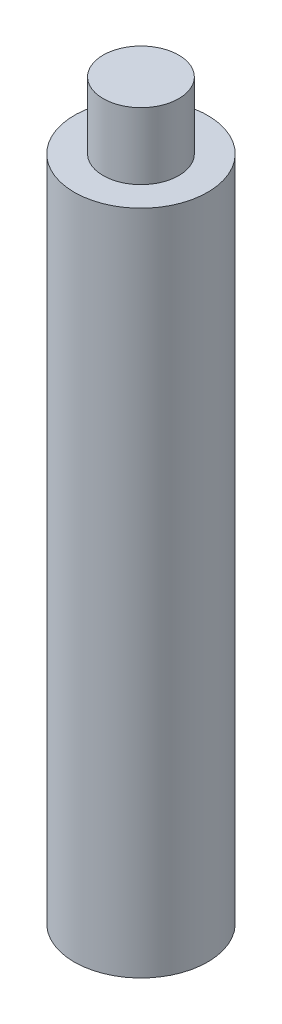
ISO-10303-21;
HEADER;
FILE_DESCRIPTION(('STEP AP214'),'2;1');
FILE_NAME('part.step','',(''),(''),'','','');
FILE_SCHEMA(('AUTOMOTIVE_DESIGN { 1 0 10303 214 1 1 1 1 }'));
ENDSEC;
DATA;
#1=APPLICATION_CONTEXT('core data for automotive mechanical design processes');
#2=APPLICATION_PROTOCOL_DEFINITION('international standard','automotive_design',2000,#1);
#3=PRODUCT_CONTEXT('',#1,'mechanical');
#4=PRODUCT('Part','Part','',(#3));
#5=PRODUCT_RELATED_PRODUCT_CATEGORY('part','',(#4));
#6=PRODUCT_DEFINITION_FORMATION('','',#4);
#7=PRODUCT_DEFINITION_CONTEXT('part definition',#1,'design');
#8=PRODUCT_DEFINITION('design','',#6,#7);
#9=PRODUCT_DEFINITION_SHAPE('','',#8);
#10=(LENGTH_UNIT() NAMED_UNIT(*) SI_UNIT(.MILLI.,.METRE.));
#11=(NAMED_UNIT(*) PLANE_ANGLE_UNIT() SI_UNIT($,.RADIAN.));
#12=(NAMED_UNIT(*) SI_UNIT($,.STERADIAN.) SOLID_ANGLE_UNIT());
#13=UNCERTAINTY_MEASURE_WITH_UNIT(LENGTH_MEASURE(1.E-05),#10,'distance_accuracy_value','');
#14=(GEOMETRIC_REPRESENTATION_CONTEXT(3) GLOBAL_UNCERTAINTY_ASSIGNED_CONTEXT((#13)) GLOBAL_UNIT_ASSIGNED_CONTEXT((#10,
#11,#12)) REPRESENTATION_CONTEXT('',''));
#15=CARTESIAN_POINT('',(0.,0.,0.));
#16=DIRECTION('',(0.,0.,1.));
#17=DIRECTION('',(1.,0.,0.));
#18=AXIS2_PLACEMENT_3D('',#15,#16,#17);
#19=CARTESIAN_POINT('',(-54.3568054312168,-67.0985978800645,-8.65683378398795));
#20=DIRECTION('',(0.,-1.,0.));
#21=DIRECTION('',(0.,0.,-1.));
#22=AXIS2_PLACEMENT_3D('',#19,#20,#21);
#23=CYLINDRICAL_SURFACE('',#22,1.7);
#24=CARTESIAN_POINT('',(-54.3568054312168,-67.0985978800645,-8.65683378398795));
#25=DIRECTION('',(0.,1.,0.));
#26=DIRECTION('',(0.,0.,1.));
#27=AXIS2_PLACEMENT_3D('',#24,#25,#26);
#28=CIRCLE('',#27,1.7);
#29=CARTESIAN_POINT('',(-54.3568054312168,-67.0985978800645,-6.95683378398795));
#30=VERTEX_POINT('',#29);
#31=EDGE_CURVE('E11',#30,#30,#28,.T.);
#32=ORIENTED_EDGE('',*,*,#31,.F.);
#33=EDGE_LOOP('',(#32));
#34=FACE_BOUND('',#33,.T.);
#35=CARTESIAN_POINT('',(-54.3568054312168,-70.0985978800645,-8.65683378398795));
#36=DIRECTION('',(0.,1.,0.));
#37=DIRECTION('',(0.,0.,1.));
#38=AXIS2_PLACEMENT_3D('',#35,#36,#37);
#39=CIRCLE('',#38,1.7);
#40=CARTESIAN_POINT('',(-54.3568054312168,-70.0985978800645,-6.95683378398795));
#41=VERTEX_POINT('',#40);
#42=EDGE_CURVE('E48',#41,#41,#39,.T.);
#43=ORIENTED_EDGE('',*,*,#42,.T.);
#44=EDGE_LOOP('',(#43));
#45=FACE_BOUND('',#44,.T.);
#46=ADVANCED_FACE('F44',(#34,#45),#23,.T.);
#47=CARTESIAN_POINT('',(-54.3568054312168,-67.0985978800645,-8.65683378398795));
#48=DIRECTION('',(0.,1.,0.));
#49=DIRECTION('',(0.,0.,1.));
#50=AXIS2_PLACEMENT_3D('',#47,#48,#49);
#51=PLANE('',#50);
#52=ORIENTED_EDGE('',*,*,#31,.T.);
#53=EDGE_LOOP('',(#52));
#54=FACE_BOUND('',#53,.T.);
#55=ADVANCED_FACE('F58',(#54),#51,.T.);
#56=CARTESIAN_POINT('',(-54.3568054312168,-70.0985978800645,-8.65683378398795));
#57=DIRECTION('',(0.,1.,0.));
#58=DIRECTION('',(0.,0.,1.));
#59=AXIS2_PLACEMENT_3D('',#56,#57,#58);
#60=PLANE('',#59);
#61=ORIENTED_EDGE('',*,*,#42,.F.);
#62=EDGE_LOOP('',(#61));
#63=FACE_BOUND('',#62,.T.);
#64=ADVANCED_FACE('F59',(#63),#60,.F.);
#65=CLOSED_SHELL('',(#46,#55,#64));
#66=MANIFOLD_SOLID_BREP('B2',#65);
#67=CARTESIAN_POINT('',(-54.3568054312168,-70.0985978800645,-8.65683378398795));
#68=DIRECTION('',(0.,1.,0.));
#69=DIRECTION('',(0.,0.,1.));
#70=AXIS2_PLACEMENT_3D('',#67,#68,#69);
#71=PLANE('',#70);
#72=CARTESIAN_POINT('',(-54.3568054312168,-70.0985978800645,-8.65683378398795));
#73=DIRECTION('',(0.,1.,0.));
#74=DIRECTION('',(0.,0.,1.));
#75=AXIS2_PLACEMENT_3D('',#72,#73,#74);
#76=CIRCLE('',#75,3.);
#77=CARTESIAN_POINT('',(-54.3568054312168,-70.0985978800645,-5.65683378398795));
#78=VERTEX_POINT('',#77);
#79=EDGE_CURVE('E42',#78,#78,#76,.T.);
#80=ORIENTED_EDGE('',*,*,#79,.T.);
#81=EDGE_LOOP('',(#80));
#82=FACE_BOUND('',#81,.T.);
#83=CARTESIAN_POINT('',(-54.3568054312168,-70.0985978800645,-8.65683378398795));
#84=DIRECTION('',(0.,1.,0.));
#85=DIRECTION('',(0.,0.,1.));
#86=AXIS2_PLACEMENT_3D('',#83,#84,#85);
#87=CIRCLE('',#86,1.7);
#88=CARTESIAN_POINT('',(-54.3568054312168,-70.0985978800645,-6.95683378398795));
#89=VERTEX_POINT('',#88);
#90=EDGE_CURVE('E100',#89,#89,#87,.T.);
#91=ORIENTED_EDGE('',*,*,#90,.F.);
#92=EDGE_LOOP('',(#91));
#93=FACE_BOUND('',#92,.T.);
#94=ADVANCED_FACE('F88',(#82,#93),#71,.T.);
#95=CARTESIAN_POINT('',(-54.3568054312168,-100.098597880065,-8.65683378398795));
#96=DIRECTION('',(0.,1.,0.));
#97=DIRECTION('',(0.,0.,1.));
#98=AXIS2_PLACEMENT_3D('',#95,#96,#97);
#99=PLANE('',#98);
#100=CARTESIAN_POINT('',(-54.3568054312168,-100.098597880065,-8.65683378398795));
#101=DIRECTION('',(0.,1.,0.));
#102=DIRECTION('',(0.,0.,1.));
#103=AXIS2_PLACEMENT_3D('',#100,#101,#102);
#104=CIRCLE('',#103,3.);
#105=CARTESIAN_POINT('',(-54.3568054312168,-100.098597880065,-5.65683378398795));
#106=VERTEX_POINT('',#105);
#107=EDGE_CURVE('E89',#106,#106,#104,.T.);
#108=ORIENTED_EDGE('',*,*,#107,.F.);
#109=EDGE_LOOP('',(#108));
#110=FACE_BOUND('',#109,.T.);
#111=CARTESIAN_POINT('',(-54.3568054312168,-100.098597880065,-8.65683378398795));
#112=DIRECTION('',(0.,1.,0.));
#113=DIRECTION('',(0.,0.,1.));
#114=AXIS2_PLACEMENT_3D('',#111,#112,#113);
#115=CIRCLE('',#114,1.7);
#116=CARTESIAN_POINT('',(-54.3568054312168,-100.098597880065,-6.95683378398795));
#117=VERTEX_POINT('',#116);
#118=EDGE_CURVE('E97',#117,#117,#115,.T.);
#119=ORIENTED_EDGE('',*,*,#118,.T.);
#120=EDGE_LOOP('',(#119));
#121=FACE_BOUND('',#120,.T.);
#122=ADVANCED_FACE('F108',(#110,#121),#99,.F.);
#123=CARTESIAN_POINT('',(-54.3568054312168,-70.0985978800645,-8.65683378398795));
#124=DIRECTION('',(0.,-1.,0.));
#125=DIRECTION('',(0.,0.,-1.));
#126=AXIS2_PLACEMENT_3D('',#123,#124,#125);
#127=CYLINDRICAL_SURFACE('',#126,3.);
#128=ORIENTED_EDGE('',*,*,#79,.F.);
#129=EDGE_LOOP('',(#128));
#130=FACE_BOUND('',#129,.T.);
#131=ORIENTED_EDGE('',*,*,#107,.T.);
#132=EDGE_LOOP('',(#131));
#133=FACE_BOUND('',#132,.T.);
#134=ADVANCED_FACE('F86',(#130,#133),#127,.T.);
#135=CARTESIAN_POINT('',(-54.3568054312168,-70.0985978800645,-8.65683378398795));
#136=DIRECTION('',(0.,-1.,0.));
#137=DIRECTION('',(0.,0.,-1.));
#138=AXIS2_PLACEMENT_3D('',#135,#136,#137);
#139=CYLINDRICAL_SURFACE('',#138,1.7);
#140=ORIENTED_EDGE('',*,*,#90,.T.);
#141=EDGE_LOOP('',(#140));
#142=FACE_BOUND('',#141,.T.);
#143=ORIENTED_EDGE('',*,*,#118,.F.);
#144=EDGE_LOOP('',(#143));
#145=FACE_BOUND('',#144,.T.);
#146=ADVANCED_FACE('F104',(#142,#145),#139,.F.);
#147=CLOSED_SHELL('',(#94,#122,#134,#146));
#148=MANIFOLD_SOLID_BREP('B6',#147);
#149=ADVANCED_BREP_SHAPE_REPRESENTATION('',(#18,#66,#148),#14);
#150=SHAPE_DEFINITION_REPRESENTATION(#9,#149);
ENDSEC;
END-ISO-10303-21;
